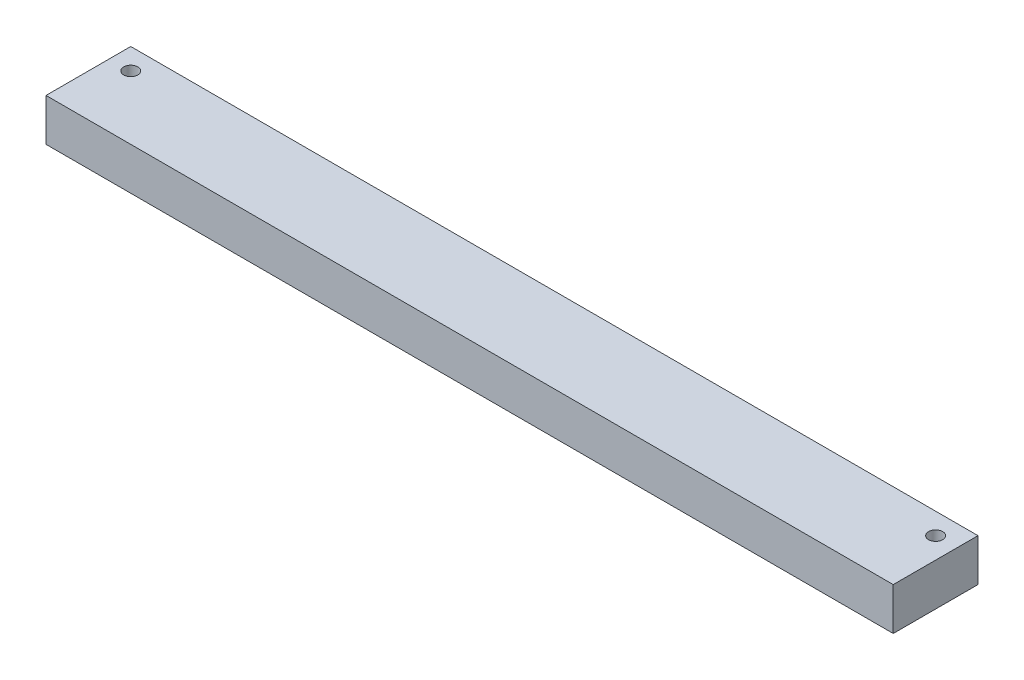
ISO-10303-21;
HEADER;
FILE_DESCRIPTION(('STEP AP214'),'2;1');
FILE_NAME('part.step','',(''),(''),'','','');
FILE_SCHEMA(('AUTOMOTIVE_DESIGN { 1 0 10303 214 1 1 1 1 }'));
ENDSEC;
DATA;
#1=APPLICATION_CONTEXT('core data for automotive mechanical design processes');
#2=APPLICATION_PROTOCOL_DEFINITION('international standard','automotive_design',2000,#1);
#3=PRODUCT_CONTEXT('',#1,'mechanical');
#4=PRODUCT('Part','Part','',(#3));
#5=PRODUCT_RELATED_PRODUCT_CATEGORY('part','',(#4));
#6=PRODUCT_DEFINITION_FORMATION('','',#4);
#7=PRODUCT_DEFINITION_CONTEXT('part definition',#1,'design');
#8=PRODUCT_DEFINITION('design','',#6,#7);
#9=PRODUCT_DEFINITION_SHAPE('','',#8);
#10=(LENGTH_UNIT() NAMED_UNIT(*) SI_UNIT(.MILLI.,.METRE.));
#11=(NAMED_UNIT(*) PLANE_ANGLE_UNIT() SI_UNIT($,.RADIAN.));
#12=(NAMED_UNIT(*) SI_UNIT($,.STERADIAN.) SOLID_ANGLE_UNIT());
#13=UNCERTAINTY_MEASURE_WITH_UNIT(LENGTH_MEASURE(1.E-05),#10,'distance_accuracy_value','');
#14=(GEOMETRIC_REPRESENTATION_CONTEXT(3) GLOBAL_UNCERTAINTY_ASSIGNED_CONTEXT((#13)) GLOBAL_UNIT_ASSIGNED_CONTEXT((#10,
#11,#12)) REPRESENTATION_CONTEXT('',''));
#15=CARTESIAN_POINT('',(0.,0.,0.));
#16=DIRECTION('',(0.,0.,1.));
#17=DIRECTION('',(1.,0.,0.));
#18=AXIS2_PLACEMENT_3D('',#15,#16,#17);
#19=CARTESIAN_POINT('',(0.,3.,0.));
#20=DIRECTION('',(0.,1.,0.));
#21=DIRECTION('',(0.,0.,1.));
#22=AXIS2_PLACEMENT_3D('',#19,#20,#21);
#23=PLANE('',#22);
#24=CARTESIAN_POINT('',(-28.4909336238845,3.,-1.50093362388452));
#25=DIRECTION('',(0.,1.,0.));
#26=DIRECTION('',(0.,0.,1.));
#27=AXIS2_PLACEMENT_3D('',#24,#25,#26);
#28=CIRCLE('',#27,0.499999999999999);
#29=CARTESIAN_POINT('',(-28.4909336238845,3.,-1.00093362388452));
#30=VERTEX_POINT('',#29);
#31=EDGE_CURVE('E99',#30,#30,#28,.T.);
#32=ORIENTED_EDGE('',*,*,#31,.F.);
#33=EDGE_LOOP('',(#32));
#34=FACE_BOUND('',#33,.T.);
#35=DIRECTION('',(0.,0.,1.));
#36=VECTOR('',#35,1.);
#37=CARTESIAN_POINT('',(-29.99,3.,3.));
#38=LINE('',#37,#36);
#39=CARTESIAN_POINT('',(-29.99,3.,-3.));
#40=VERTEX_POINT('',#39);
#41=CARTESIAN_POINT('',(-29.99,3.,3.));
#42=VERTEX_POINT('',#41);
#43=EDGE_CURVE('E84',#40,#42,#38,.T.);
#44=ORIENTED_EDGE('',*,*,#43,.T.);
#45=DIRECTION('',(1.,0.,0.));
#46=VECTOR('',#45,1.);
#47=CARTESIAN_POINT('',(29.99,3.,3.));
#48=LINE('',#47,#46);
#49=CARTESIAN_POINT('',(29.99,3.,3.));
#50=VERTEX_POINT('',#49);
#51=EDGE_CURVE('E79',#42,#50,#48,.T.);
#52=ORIENTED_EDGE('',*,*,#51,.T.);
#53=DIRECTION('',(0.,0.,-1.));
#54=VECTOR('',#53,1.);
#55=CARTESIAN_POINT('',(29.99,3.,3.));
#56=LINE('',#55,#54);
#57=CARTESIAN_POINT('',(29.99,3.,-3.));
#58=VERTEX_POINT('',#57);
#59=EDGE_CURVE('E82',#50,#58,#56,.T.);
#60=ORIENTED_EDGE('',*,*,#59,.T.);
#61=DIRECTION('',(-1.,0.,0.));
#62=VECTOR('',#61,1.);
#63=CARTESIAN_POINT('',(29.99,3.,-3.));
#64=LINE('',#63,#62);
#65=EDGE_CURVE('E49',#58,#40,#64,.T.);
#66=ORIENTED_EDGE('',*,*,#65,.T.);
#67=EDGE_LOOP('',(#44,#52,#60,#66));
#68=FACE_BOUND('',#67,.T.);
#69=CARTESIAN_POINT('',(28.4909336238845,3.,-1.50093362388452));
#70=DIRECTION('',(0.,1.,0.));
#71=DIRECTION('',(0.,0.,-1.));
#72=AXIS2_PLACEMENT_3D('',#69,#70,#71);
#73=CIRCLE('',#72,0.499999999999999);
#74=CARTESIAN_POINT('',(28.4909336238845,3.,-2.00093362388452));
#75=VERTEX_POINT('',#74);
#76=EDGE_CURVE('E114',#75,#75,#73,.T.);
#77=ORIENTED_EDGE('',*,*,#76,.F.);
#78=EDGE_LOOP('',(#77));
#79=FACE_BOUND('',#78,.T.);
#80=ADVANCED_FACE('F32',(#34,#68,#79),#23,.T.);
#81=CARTESIAN_POINT('',(0.,0.,0.));
#82=DIRECTION('',(0.,1.,0.));
#83=DIRECTION('',(0.,0.,1.));
#84=AXIS2_PLACEMENT_3D('',#81,#82,#83);
#85=PLANE('',#84);
#86=DIRECTION('',(0.,0.,1.));
#87=VECTOR('',#86,1.);
#88=CARTESIAN_POINT('',(-29.99,0.,3.));
#89=LINE('',#88,#87);
#90=CARTESIAN_POINT('',(-29.99,0.,-3.));
#91=VERTEX_POINT('',#90);
#92=CARTESIAN_POINT('',(-29.99,0.,3.));
#93=VERTEX_POINT('',#92);
#94=EDGE_CURVE('E96',#91,#93,#89,.T.);
#95=ORIENTED_EDGE('',*,*,#94,.F.);
#96=DIRECTION('',(-1.,0.,0.));
#97=VECTOR('',#96,1.);
#98=CARTESIAN_POINT('',(29.99,0.,-3.));
#99=LINE('',#98,#97);
#100=CARTESIAN_POINT('',(29.99,0.,-3.));
#101=VERTEX_POINT('',#100);
#102=EDGE_CURVE('E72',#101,#91,#99,.T.);
#103=ORIENTED_EDGE('',*,*,#102,.F.);
#104=DIRECTION('',(0.,0.,-1.));
#105=VECTOR('',#104,1.);
#106=CARTESIAN_POINT('',(29.99,0.,3.));
#107=LINE('',#106,#105);
#108=CARTESIAN_POINT('',(29.99,0.,3.));
#109=VERTEX_POINT('',#108);
#110=EDGE_CURVE('E66',#109,#101,#107,.T.);
#111=ORIENTED_EDGE('',*,*,#110,.F.);
#112=DIRECTION('',(1.,0.,0.));
#113=VECTOR('',#112,1.);
#114=CARTESIAN_POINT('',(29.99,0.,3.));
#115=LINE('',#114,#113);
#116=EDGE_CURVE('E88',#93,#109,#115,.T.);
#117=ORIENTED_EDGE('',*,*,#116,.F.);
#118=EDGE_LOOP('',(#95,#103,#111,#117));
#119=FACE_BOUND('',#118,.T.);
#120=CARTESIAN_POINT('',(-28.4909336238845,0.,-1.50093362388452));
#121=DIRECTION('',(0.,1.,0.));
#122=DIRECTION('',(0.,0.,1.));
#123=AXIS2_PLACEMENT_3D('',#120,#121,#122);
#124=CIRCLE('',#123,0.499999999999999);
#125=CARTESIAN_POINT('',(-28.4909336238845,0.,-1.00093362388452));
#126=VERTEX_POINT('',#125);
#127=EDGE_CURVE('E111',#126,#126,#124,.T.);
#128=ORIENTED_EDGE('',*,*,#127,.T.);
#129=EDGE_LOOP('',(#128));
#130=FACE_BOUND('',#129,.T.);
#131=CARTESIAN_POINT('',(28.4909336238845,0.,-1.50093362388452));
#132=DIRECTION('',(0.,1.,0.));
#133=DIRECTION('',(0.,0.,-1.));
#134=AXIS2_PLACEMENT_3D('',#131,#132,#133);
#135=CIRCLE('',#134,0.499999999999999);
#136=CARTESIAN_POINT('',(28.4909336238845,0.,-2.00093362388452));
#137=VERTEX_POINT('',#136);
#138=EDGE_CURVE('E117',#137,#137,#135,.T.);
#139=ORIENTED_EDGE('',*,*,#138,.T.);
#140=EDGE_LOOP('',(#139));
#141=FACE_BOUND('',#140,.T.);
#142=ADVANCED_FACE('F107',(#119,#130,#141),#85,.F.);
#143=CARTESIAN_POINT('',(-29.99,3.,3.));
#144=DIRECTION('',(1.,0.,0.));
#145=DIRECTION('',(0.,0.,-1.));
#146=AXIS2_PLACEMENT_3D('',#143,#144,#145);
#147=PLANE('',#146);
#148=ORIENTED_EDGE('',*,*,#94,.T.);
#149=DIRECTION('',(0.,-1.,0.));
#150=VECTOR('',#149,1.);
#151=CARTESIAN_POINT('',(-29.99,3.,3.));
#152=LINE('',#151,#150);
#153=EDGE_CURVE('E11',#42,#93,#152,.T.);
#154=ORIENTED_EDGE('',*,*,#153,.F.);
#155=ORIENTED_EDGE('',*,*,#43,.F.);
#156=DIRECTION('',(0.,-1.,0.));
#157=VECTOR('',#156,1.);
#158=CARTESIAN_POINT('',(-29.99,3.,-3.));
#159=LINE('',#158,#157);
#160=EDGE_CURVE('E92',#40,#91,#159,.T.);
#161=ORIENTED_EDGE('',*,*,#160,.T.);
#162=EDGE_LOOP('',(#148,#154,#155,#161));
#163=FACE_BOUND('',#162,.T.);
#164=ADVANCED_FACE('F34',(#163),#147,.F.);
#165=CARTESIAN_POINT('',(29.99,3.,3.));
#166=DIRECTION('',(0.,0.,-1.));
#167=DIRECTION('',(-1.,0.,0.));
#168=AXIS2_PLACEMENT_3D('',#165,#166,#167);
#169=PLANE('',#168);
#170=ORIENTED_EDGE('',*,*,#116,.T.);
#171=DIRECTION('',(0.,-1.,0.));
#172=VECTOR('',#171,1.);
#173=CARTESIAN_POINT('',(29.99,3.,3.));
#174=LINE('',#173,#172);
#175=EDGE_CURVE('E41',#50,#109,#174,.T.);
#176=ORIENTED_EDGE('',*,*,#175,.F.);
#177=ORIENTED_EDGE('',*,*,#51,.F.);
#178=ORIENTED_EDGE('',*,*,#153,.T.);
#179=EDGE_LOOP('',(#170,#176,#177,#178));
#180=FACE_BOUND('',#179,.T.);
#181=ADVANCED_FACE('F87',(#180),#169,.F.);
#182=CARTESIAN_POINT('',(29.99,3.,3.));
#183=DIRECTION('',(-1.,0.,0.));
#184=DIRECTION('',(0.,0.,1.));
#185=AXIS2_PLACEMENT_3D('',#182,#183,#184);
#186=PLANE('',#185);
#187=ORIENTED_EDGE('',*,*,#110,.T.);
#188=DIRECTION('',(0.,-1.,0.));
#189=VECTOR('',#188,1.);
#190=CARTESIAN_POINT('',(29.99,3.,-3.));
#191=LINE('',#190,#189);
#192=EDGE_CURVE('E89',#58,#101,#191,.T.);
#193=ORIENTED_EDGE('',*,*,#192,.F.);
#194=ORIENTED_EDGE('',*,*,#59,.F.);
#195=ORIENTED_EDGE('',*,*,#175,.T.);
#196=EDGE_LOOP('',(#187,#193,#194,#195));
#197=FACE_BOUND('',#196,.T.);
#198=ADVANCED_FACE('F90',(#197),#186,.F.);
#199=CARTESIAN_POINT('',(29.99,3.,-3.));
#200=DIRECTION('',(0.,0.,1.));
#201=DIRECTION('',(1.,0.,0.));
#202=AXIS2_PLACEMENT_3D('',#199,#200,#201);
#203=PLANE('',#202);
#204=ORIENTED_EDGE('',*,*,#102,.T.);
#205=ORIENTED_EDGE('',*,*,#160,.F.);
#206=ORIENTED_EDGE('',*,*,#65,.F.);
#207=ORIENTED_EDGE('',*,*,#192,.T.);
#208=EDGE_LOOP('',(#204,#205,#206,#207));
#209=FACE_BOUND('',#208,.T.);
#210=ADVANCED_FACE('F104',(#209),#203,.F.);
#211=CARTESIAN_POINT('',(-28.4909336238845,3.,-1.50093362388452));
#212=DIRECTION('',(0.,-1.,0.));
#213=DIRECTION('',(0.,0.,-1.));
#214=AXIS2_PLACEMENT_3D('',#211,#212,#213);
#215=CYLINDRICAL_SURFACE('',#214,0.499999999999999);
#216=ORIENTED_EDGE('',*,*,#31,.T.);
#217=EDGE_LOOP('',(#216));
#218=FACE_BOUND('',#217,.T.);
#219=ORIENTED_EDGE('',*,*,#127,.F.);
#220=EDGE_LOOP('',(#219));
#221=FACE_BOUND('',#220,.T.);
#222=ADVANCED_FACE('F134',(#218,#221),#215,.F.);
#223=CARTESIAN_POINT('',(28.4909336238845,3.,-1.50093362388452));
#224=DIRECTION('',(0.,-1.,0.));
#225=DIRECTION('',(0.,0.,-1.));
#226=AXIS2_PLACEMENT_3D('',#223,#224,#225);
#227=CYLINDRICAL_SURFACE('',#226,0.499999999999999);
#228=ORIENTED_EDGE('',*,*,#76,.T.);
#229=EDGE_LOOP('',(#228));
#230=FACE_BOUND('',#229,.T.);
#231=ORIENTED_EDGE('',*,*,#138,.F.);
#232=EDGE_LOOP('',(#231));
#233=FACE_BOUND('',#232,.T.);
#234=ADVANCED_FACE('F123',(#230,#233),#227,.F.);
#235=CLOSED_SHELL('',(#80,#142,#164,#181,#198,#210,#222,#234));
#236=MANIFOLD_SOLID_BREP('B2',#235);
#237=ADVANCED_BREP_SHAPE_REPRESENTATION('',(#18,#236),#14);
#238=SHAPE_DEFINITION_REPRESENTATION(#9,#237);
ENDSEC;
END-ISO-10303-21;
